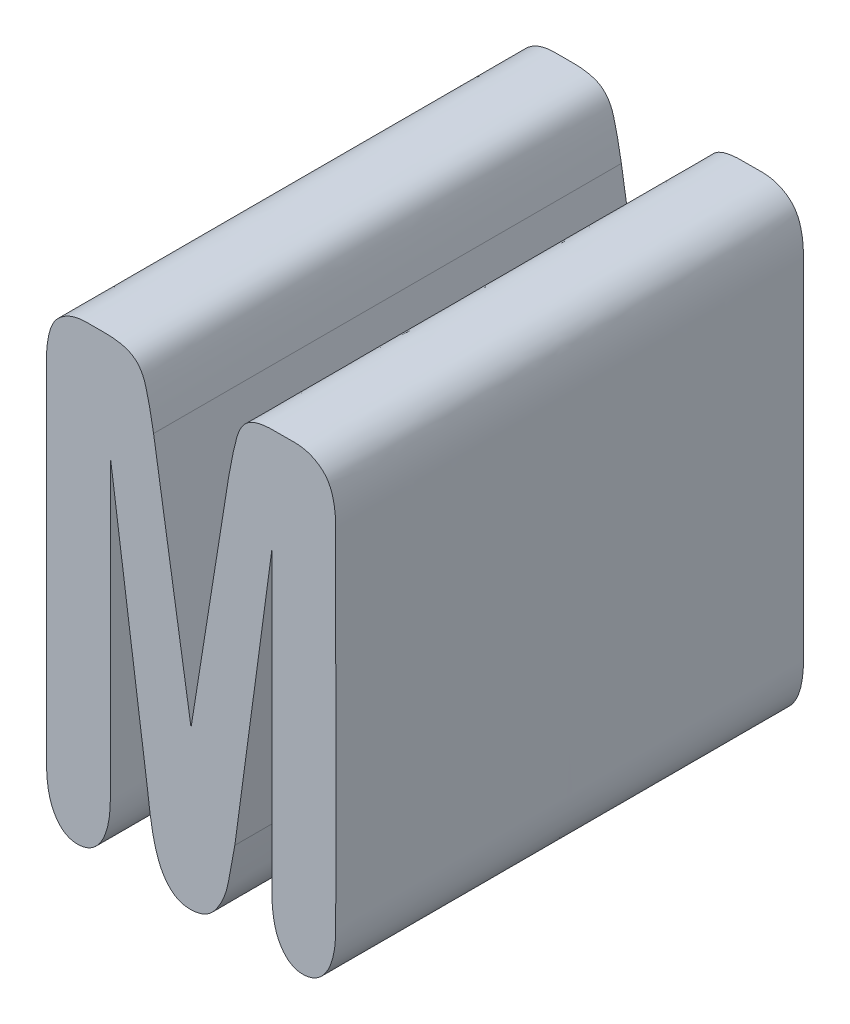
ISO-10303-21;
HEADER;
FILE_DESCRIPTION(('STEP AP214'),'2;1');
FILE_NAME('part.step','',(''),(''),'','','');
FILE_SCHEMA(('AUTOMOTIVE_DESIGN { 1 0 10303 214 1 1 1 1 }'));
ENDSEC;
DATA;
#1=APPLICATION_CONTEXT('core data for automotive mechanical design processes');
#2=APPLICATION_PROTOCOL_DEFINITION('international standard','automotive_design',2000,#1);
#3=PRODUCT_CONTEXT('',#1,'mechanical');
#4=PRODUCT('Part','Part','',(#3));
#5=PRODUCT_RELATED_PRODUCT_CATEGORY('part','',(#4));
#6=PRODUCT_DEFINITION_FORMATION('','',#4);
#7=PRODUCT_DEFINITION_CONTEXT('part definition',#1,'design');
#8=PRODUCT_DEFINITION('design','',#6,#7);
#9=PRODUCT_DEFINITION_SHAPE('','',#8);
#10=(LENGTH_UNIT() NAMED_UNIT(*) SI_UNIT(.MILLI.,.METRE.));
#11=(NAMED_UNIT(*) PLANE_ANGLE_UNIT() SI_UNIT($,.RADIAN.));
#12=(NAMED_UNIT(*) SI_UNIT($,.STERADIAN.) SOLID_ANGLE_UNIT());
#13=UNCERTAINTY_MEASURE_WITH_UNIT(LENGTH_MEASURE(1.E-05),#10,'distance_accuracy_value','');
#14=(GEOMETRIC_REPRESENTATION_CONTEXT(3) GLOBAL_UNCERTAINTY_ASSIGNED_CONTEXT((#13)) GLOBAL_UNIT_ASSIGNED_CONTEXT((#10,
#11,#12)) REPRESENTATION_CONTEXT('',''));
#15=CARTESIAN_POINT('',(0.,0.,0.));
#16=DIRECTION('',(0.,0.,1.));
#17=DIRECTION('',(1.,0.,0.));
#18=AXIS2_PLACEMENT_3D('',#15,#16,#17);
#19=CARTESIAN_POINT('',(-7.60393574297189,-0.00451807228915673,2.79));
#20=DIRECTION('',(0.,0.,1.));
#21=DIRECTION('',(1.,0.,0.));
#22=AXIS2_PLACEMENT_3D('',#19,#20,#21);
#23=PLANE('',#22);
#24=CARTESIAN_POINT('',(-7.50326744070966,0.0369917297939757,2.79));
#25=CARTESIAN_POINT('',(-7.50558921732555,0.0232963210130519,2.79));
#26=CARTESIAN_POINT('',(-7.50723643333539,0.0158603284734269,2.79));
#27=CARTESIAN_POINT('',(-7.50888364934523,0.00842433593380165,2.79));
#28=CARTESIAN_POINT('',(-7.51364488548533,0.00195313182232248,2.79));
#29=CARTESIAN_POINT('',(-7.51840612162544,-0.00451807228915668,2.79));
#30=CARTESIAN_POINT('',(-7.52712850639607,-0.00451807228915668,2.79));
#31=CARTESIAN_POINT('',(-7.53324673072392,-0.00451807228915668,2.79));
#32=CARTESIAN_POINT('',(-7.53745889486074,-0.000517692192436581,2.79));
#33=CARTESIAN_POINT('',(-7.54167105899757,0.00348268790428374,2.79));
#34=CARTESIAN_POINT('',(-7.54396146729284,0.00956561425376479,2.79));
#35=CARTESIAN_POINT('',(-7.54625187558811,0.0156485406032461,2.79));
#36=CARTESIAN_POINT('',(-7.54750689183835,0.0226374369071618,2.79));
#37=CARTESIAN_POINT('',(-7.5487619080886,0.0296263332110773,2.79));
#38=CARTESIAN_POINT('',(-7.55007968396053,0.040756778544712,2.79));
#39=B_SPLINE_CURVE_WITH_KNOTS('',2,(#24,#25,#26,#27,#28,#29,#30,#31,#32,#33,#34,#35,#36,#37,
#38),.UNSPECIFIED.,.F.,.F.,(3,2,2,2,2,2,2,3),(28.,29.,30.,31.,32.,33.,34.,35.),.UNSPECIFIED.);
#40=CARTESIAN_POINT('',(-7.50326744070966,0.0369917297939757,2.79));
#41=VERTEX_POINT('',#40);
#42=CARTESIAN_POINT('',(-7.55007968396053,0.040756778544712,2.79));
#43=VERTEX_POINT('',#42);
#44=EDGE_CURVE('E11',#41,#43,#39,.T.);
#45=ORIENTED_EDGE('',*,*,#44,.F.);
#46=CARTESIAN_POINT('',(-7.48345381526104,0.183734939759036,2.79));
#47=CARTESIAN_POINT('',(-7.49336062798535,0.110363334776506,2.79));
#48=CARTESIAN_POINT('',(-7.50326744070966,0.0369917297939757,2.79));
#49=B_SPLINE_CURVE_WITH_KNOTS('',2,(#46,#47,#48),.UNSPECIFIED.,.F.,.F.,(3,3),(27.,28.),.UNSPECIFIED.);
#50=CARTESIAN_POINT('',(-7.48345381526104,0.183734939759036,2.79));
#51=VERTEX_POINT('',#50);
#52=EDGE_CURVE('E27',#51,#41,#49,.T.);
#53=ORIENTED_EDGE('',*,*,#52,.F.);
#54=CARTESIAN_POINT('',(-7.50654618473896,0.205878216459337,2.79));
#55=CARTESIAN_POINT('',(-7.50403613691816,0.22030309381265,2.79));
#56=CARTESIAN_POINT('',(-7.50195750883292,0.227127266217537,2.79));
#57=CARTESIAN_POINT('',(-7.49987888074768,0.233951438622423,2.79));
#58=CARTESIAN_POINT('',(-7.49532158848256,0.236704634973862,2.79));
#59=CARTESIAN_POINT('',(-7.49076429621745,0.239457831325301,2.79));
#60=CARTESIAN_POINT('',(-7.48163402369683,0.239457831325301,2.79));
#61=CARTESIAN_POINT('',(-7.47677082327938,0.239457831325301,2.79));
#62=CARTESIAN_POINT('',(-7.47190762286194,0.239457831325301,2.79));
#63=CARTESIAN_POINT('',(-7.46177333427706,0.239457831325301,2.79));
#64=CARTESIAN_POINT('',(-7.45554530167668,0.233163128595867,2.79));
#65=CARTESIAN_POINT('',(-7.4493172690763,0.226868425866432,2.79));
#66=CARTESIAN_POINT('',(-7.4493172690763,0.210443352719645,2.79));
#67=CARTESIAN_POINT('',(-7.4493172690763,0.117869934763085,2.79));
#68=CARTESIAN_POINT('',(-7.4493172690763,0.0252965168065258,2.79));
#69=CARTESIAN_POINT('',(-7.4493172690763,0.0112245962563919,2.79));
#70=CARTESIAN_POINT('',(-7.45401574559472,0.00335326198361763,2.79));
#71=CARTESIAN_POINT('',(-7.45871422211314,-0.00451807228915668,2.79));
#72=CARTESIAN_POINT('',(-7.46704442244449,-0.00451807228915668,2.79));
#73=CARTESIAN_POINT('',(-7.47427647876928,-0.00451807228915668,2.79));
#74=CARTESIAN_POINT('',(-7.47886514701516,0.0030591121639223,2.79));
#75=CARTESIAN_POINT('',(-7.48345381526104,0.0106362966170013,2.79));
#76=CARTESIAN_POINT('',(-7.48345381526104,0.0252965168065258,2.79));
#77=CARTESIAN_POINT('',(-7.48345381526104,0.104515728282781,2.79));
#78=CARTESIAN_POINT('',(-7.48345381526104,0.183734939759036,2.79));
#79=B_SPLINE_CURVE_WITH_KNOTS('',2,(#54,#55,#56,#57,#58,#59,#60,#61,#62,#63,#64,#65,#66,#67,#68,
#69,#70,#71,#72,#73,#74,#75,#76,#77,#78),.UNSPECIFIED.,.F.,.F.,(3,2,2,2,2,2,2,2,2,2,2,2,3),(15.,
16.,17.,18.,19.,20.,21.,22.,23.,24.,25.,26.,27.),.UNSPECIFIED.);
#80=CARTESIAN_POINT('',(-7.50654618473896,0.205878216459337,2.79));
#81=VERTEX_POINT('',#80);
#82=EDGE_CURVE('E262',#81,#51,#79,.T.);
#83=ORIENTED_EDGE('',*,*,#82,.F.);
#84=CARTESIAN_POINT('',(-7.52665786668456,0.0798192771084338,2.79));
#85=CARTESIAN_POINT('',(-7.51660202571176,0.142848746783885,2.79));
#86=CARTESIAN_POINT('',(-7.50654618473896,0.205878216459337,2.79));
#87=B_SPLINE_CURVE_WITH_KNOTS('',2,(#84,#85,#86),.UNSPECIFIED.,.F.,.F.,(3,3),(14.,15.),.UNSPECIFIED.);
#88=CARTESIAN_POINT('',(-7.52665786668456,0.0798192771084338,2.79));
#89=VERTEX_POINT('',#88);
#90=EDGE_CURVE('E253',#89,#81,#87,.T.);
#91=ORIENTED_EDGE('',*,*,#90,.F.);
#92=CARTESIAN_POINT('',(-7.54667545132847,0.205878216459337,2.79));
#93=CARTESIAN_POINT('',(-7.53666665900651,0.142848746783885,2.79));
#94=CARTESIAN_POINT('',(-7.52665786668456,0.0798192771084338,2.79));
#95=B_SPLINE_CURVE_WITH_KNOTS('',2,(#92,#93,#94),.UNSPECIFIED.,.F.,.F.,(3,3),(13.,14.),.UNSPECIFIED.);
#96=CARTESIAN_POINT('',(-7.54667545132847,0.205878216459337,2.79));
#97=VERTEX_POINT('',#96);
#98=EDGE_CURVE('E244',#97,#89,#95,.T.);
#99=ORIENTED_EDGE('',*,*,#98,.F.);
#100=CARTESIAN_POINT('',(-7.56979919678715,0.183734939759036,2.79));
#101=CARTESIAN_POINT('',(-7.56979919678715,0.104515728282781,2.79));
#102=CARTESIAN_POINT('',(-7.56979919678715,0.0252965168065258,2.79));
#103=CARTESIAN_POINT('',(-7.56979919678715,0.0112010642708165,2.79));
#104=CARTESIAN_POINT('',(-7.57449767330557,0.00334149599082978,2.79));
#105=CARTESIAN_POINT('',(-7.57919614982399,-0.00451807228915668,2.79));
#106=CARTESIAN_POINT('',(-7.58741653422265,-0.00451807228915668,2.79));
#107=CARTESIAN_POINT('',(-7.59474271848974,-0.00451807228915668,2.79));
#108=CARTESIAN_POINT('',(-7.59933923073081,0.00298852769742286,2.79));
#109=CARTESIAN_POINT('',(-7.60393574297189,0.0104951276840022,2.79));
#110=CARTESIAN_POINT('',(-7.60393574297189,0.0252965168065258,2.79));
#111=CARTESIAN_POINT('',(-7.60393574297189,0.117869934763085,2.79));
#112=CARTESIAN_POINT('',(-7.60393574297189,0.210443352719645,2.79));
#113=CARTESIAN_POINT('',(-7.60393574297189,0.22736259756352,2.79));
#114=CARTESIAN_POINT('',(-7.59793517091177,0.233410214444411,2.79));
#115=CARTESIAN_POINT('',(-7.59193459885165,0.239457831325301,2.79));
#116=CARTESIAN_POINT('',(-7.58231801394944,0.239457831325301,2.79));
#117=CARTESIAN_POINT('',(-7.57743912554161,0.239457831325301,2.79));
#118=CARTESIAN_POINT('',(-7.57256023713378,0.239457831325301,2.79));
#119=CARTESIAN_POINT('',(-7.56306914083434,0.239457831325301,2.79));
#120=CARTESIAN_POINT('',(-7.55818240843131,0.236504613096469,2.79));
#121=CARTESIAN_POINT('',(-7.55329567602829,0.233551394867637,2.79));
#122=CARTESIAN_POINT('',(-7.55120135995267,0.226750754448327,2.79));
#123=CARTESIAN_POINT('',(-7.54910704387704,0.219950114029016,2.79));
#124=CARTESIAN_POINT('',(-7.54667545132847,0.205878216459337,2.79));
#125=B_SPLINE_CURVE_WITH_KNOTS('',2,(#100,#101,#102,#103,#104,#105,#106,#107,#108,#109,#110,
#111,#112,#113,#114,#115,#116,#117,#118,#119,#120,#121,#122,#123,#124),.UNSPECIFIED.,.F.,.F.,(3,
2,2,2,2,2,2,2,2,2,2,2,3),(1.,2.,3.,4.,5.,6.,7.,8.,9.,10.,11.,12.,13.),.UNSPECIFIED.);
#126=CARTESIAN_POINT('',(-7.56979919678715,0.183734939759036,2.79));
#127=VERTEX_POINT('',#126);
#128=EDGE_CURVE('E235',#127,#97,#125,.T.);
#129=ORIENTED_EDGE('',*,*,#128,.F.);
#130=CARTESIAN_POINT('',(-7.55007968396053,0.040756778544712,2.79));
#131=CARTESIAN_POINT('',(-7.55993944037384,0.112245859151874,2.79));
#132=CARTESIAN_POINT('',(-7.56979919678715,0.183734939759036,2.79));
#133=B_SPLINE_CURVE_WITH_KNOTS('',2,(#130,#131,#132),.UNSPECIFIED.,.F.,.F.,(3,3),(0.,1.),.UNSPECIFIED.);
#134=EDGE_CURVE('E226',#43,#127,#133,.T.);
#135=ORIENTED_EDGE('',*,*,#134,.F.);
#136=EDGE_LOOP('',(#45,#53,#83,#91,#99,#129,#135));
#137=FACE_BOUND('',#136,.T.);
#138=ADVANCED_FACE('F17',(#137),#23,.T.);
#139=CARTESIAN_POINT('',(-7.55007968396053,0.0407567785447125,2.54));
#140=CARTESIAN_POINT('',(-7.55993944037384,0.112245859151875,2.54));
#141=CARTESIAN_POINT('',(-7.56979919678715,0.183734939759037,2.54));
#142=CARTESIAN_POINT('',(-7.55007968396053,0.0407567785447125,2.79));
#143=CARTESIAN_POINT('',(-7.55993944037384,0.112245859151875,2.79));
#144=CARTESIAN_POINT('',(-7.56979919678715,0.183734939759037,2.79));
#145=B_SPLINE_SURFACE_WITH_KNOTS('',1,2,((#139,#140,#141),(#142,#143,#144)),.UNSPECIFIED.,.F.,
.F.,.F.,(2,2),(3,3),(0.,0.25),(0.,1.),.UNSPECIFIED.);
#146=CARTESIAN_POINT('',(-7.55007968396053,0.040756778544712,2.79));
#147=CARTESIAN_POINT('',(-7.55007968396053,0.040756778544712,2.54));
#148=B_SPLINE_CURVE_WITH_KNOTS('',1,(#146,#147),.UNSPECIFIED.,.F.,.F.,(2,2),(-0.25,0.),.UNSPECIFIED.);
#149=CARTESIAN_POINT('',(-7.55007968396053,0.040756778544712,2.54));
#150=VERTEX_POINT('',#149);
#151=EDGE_CURVE('E114',#43,#150,#148,.T.);
#152=CARTESIAN_POINT('',(-7.56979919678715,0.183734939759036,2.54));
#153=CARTESIAN_POINT('',(-7.56979919678715,0.183734939759036,2.79));
#154=B_SPLINE_CURVE_WITH_KNOTS('',1,(#152,#153),.UNSPECIFIED.,.F.,.F.,(2,2),(0.,0.25),.UNSPECIFIED.);
#155=CARTESIAN_POINT('',(-7.56979919678715,0.183734939759036,2.54));
#156=VERTEX_POINT('',#155);
#157=EDGE_CURVE('E210',#156,#127,#154,.T.);
#158=CARTESIAN_POINT('',(-7.55007968396053,0.040756778544712,2.54));
#159=CARTESIAN_POINT('',(-7.55993944037384,0.112245859151874,2.54));
#160=CARTESIAN_POINT('',(-7.56979919678715,0.183734939759036,2.54));
#161=B_SPLINE_CURVE_WITH_KNOTS('',2,(#158,#159,#160),.UNSPECIFIED.,.F.,.F.,(3,3),(0.,1.),.UNSPECIFIED.);
#162=EDGE_CURVE('E202',#150,#156,#161,.T.);
#163=ORIENTED_EDGE('',*,*,#151,.F.);
#164=ORIENTED_EDGE('',*,*,#134,.T.);
#165=ORIENTED_EDGE('',*,*,#157,.F.);
#166=ORIENTED_EDGE('',*,*,#162,.F.);
#167=EDGE_LOOP('',(#163,#164,#165,#166));
#168=FACE_BOUND('',#167,.T.);
#169=ADVANCED_FACE('F294',(#168),#145,.T.);
#170=CARTESIAN_POINT('',(-7.56979919678715,0.183734939759036,2.54));
#171=CARTESIAN_POINT('',(-7.56979919678715,0.104515728282781,2.54));
#172=CARTESIAN_POINT('',(-7.56979919678715,0.0252965168065258,2.54));
#173=CARTESIAN_POINT('',(-7.56979919678715,0.0112010642708165,2.54));
#174=CARTESIAN_POINT('',(-7.57449767330557,0.00334149599082978,2.54));
#175=CARTESIAN_POINT('',(-7.57919614982399,-0.00451807228915668,2.54));
#176=CARTESIAN_POINT('',(-7.58741653422265,-0.00451807228915668,2.54));
#177=CARTESIAN_POINT('',(-7.59474271848974,-0.00451807228915668,2.54));
#178=CARTESIAN_POINT('',(-7.59933923073081,0.00298852769742286,2.54));
#179=CARTESIAN_POINT('',(-7.60393574297189,0.0104951276840022,2.54));
#180=CARTESIAN_POINT('',(-7.60393574297189,0.0252965168065258,2.54));
#181=CARTESIAN_POINT('',(-7.60393574297189,0.117869934763085,2.54));
#182=CARTESIAN_POINT('',(-7.60393574297189,0.210443352719645,2.54));
#183=CARTESIAN_POINT('',(-7.60393574297189,0.22736259756352,2.54));
#184=CARTESIAN_POINT('',(-7.59793517091177,0.233410214444411,2.54));
#185=CARTESIAN_POINT('',(-7.59193459885165,0.239457831325301,2.54));
#186=CARTESIAN_POINT('',(-7.58231801394944,0.239457831325301,2.54));
#187=CARTESIAN_POINT('',(-7.57743912554161,0.239457831325301,2.54));
#188=CARTESIAN_POINT('',(-7.57256023713378,0.239457831325301,2.54));
#189=CARTESIAN_POINT('',(-7.56306914083434,0.239457831325301,2.54));
#190=CARTESIAN_POINT('',(-7.55818240843132,0.236504613096469,2.54));
#191=CARTESIAN_POINT('',(-7.55329567602829,0.233551394867637,2.54));
#192=CARTESIAN_POINT('',(-7.55120135995267,0.226750754448327,2.54));
#193=CARTESIAN_POINT('',(-7.54910704387704,0.219950114029016,2.54));
#194=CARTESIAN_POINT('',(-7.54667545132847,0.205878216459337,2.54));
#195=CARTESIAN_POINT('',(-7.56979919678715,0.183734939759036,2.79));
#196=CARTESIAN_POINT('',(-7.56979919678715,0.104515728282781,2.79));
#197=CARTESIAN_POINT('',(-7.56979919678715,0.0252965168065258,2.79));
#198=CARTESIAN_POINT('',(-7.56979919678715,0.0112010642708165,2.79));
#199=CARTESIAN_POINT('',(-7.57449767330557,0.00334149599082978,2.79));
#200=CARTESIAN_POINT('',(-7.57919614982399,-0.00451807228915668,2.79));
#201=CARTESIAN_POINT('',(-7.58741653422265,-0.00451807228915668,2.79));
#202=CARTESIAN_POINT('',(-7.59474271848974,-0.00451807228915668,2.79));
#203=CARTESIAN_POINT('',(-7.59933923073081,0.00298852769742286,2.79));
#204=CARTESIAN_POINT('',(-7.60393574297189,0.0104951276840022,2.79));
#205=CARTESIAN_POINT('',(-7.60393574297189,0.0252965168065258,2.79));
#206=CARTESIAN_POINT('',(-7.60393574297189,0.117869934763085,2.79));
#207=CARTESIAN_POINT('',(-7.60393574297189,0.210443352719645,2.79));
#208=CARTESIAN_POINT('',(-7.60393574297189,0.22736259756352,2.79));
#209=CARTESIAN_POINT('',(-7.59793517091177,0.233410214444411,2.79));
#210=CARTESIAN_POINT('',(-7.59193459885165,0.239457831325301,2.79));
#211=CARTESIAN_POINT('',(-7.58231801394944,0.239457831325301,2.79));
#212=CARTESIAN_POINT('',(-7.57743912554161,0.239457831325301,2.79));
#213=CARTESIAN_POINT('',(-7.57256023713378,0.239457831325301,2.79));
#214=CARTESIAN_POINT('',(-7.56306914083434,0.239457831325301,2.79));
#215=CARTESIAN_POINT('',(-7.55818240843132,0.236504613096469,2.79));
#216=CARTESIAN_POINT('',(-7.55329567602829,0.233551394867637,2.79));
#217=CARTESIAN_POINT('',(-7.55120135995267,0.226750754448327,2.79));
#218=CARTESIAN_POINT('',(-7.54910704387704,0.219950114029016,2.79));
#219=CARTESIAN_POINT('',(-7.54667545132847,0.205878216459337,2.79));
#220=B_SPLINE_SURFACE_WITH_KNOTS('',1,2,((#170,#171,#172,#173,#174,#175,#176,#177,#178,#179,
#180,#181,#182,#183,#184,#185,#186,#187,#188,#189,#190,#191,#192,#193,#194),(#195,#196,#197,
#198,#199,#200,#201,#202,#203,#204,#205,#206,#207,#208,#209,#210,#211,#212,#213,#214,#215,#216,
#217,#218,#219)),.UNSPECIFIED.,.F.,.F.,.F.,(2,2),(3,2,2,2,2,2,2,2,2,2,2,2,3),(0.,0.25),(1.,2.,
3.,4.,5.,6.,7.,8.,9.,10.,11.,12.,13.),.UNSPECIFIED.);
#221=CARTESIAN_POINT('',(-7.54667545132847,0.205878216459337,2.54));
#222=CARTESIAN_POINT('',(-7.54667545132847,0.205878216459337,2.79));
#223=B_SPLINE_CURVE_WITH_KNOTS('',1,(#221,#222),.UNSPECIFIED.,.F.,.F.,(2,2),(0.,0.25),.UNSPECIFIED.);
#224=CARTESIAN_POINT('',(-7.54667545132847,0.205878216459337,2.54));
#225=VERTEX_POINT('',#224);
#226=EDGE_CURVE('E193',#225,#97,#223,.T.);
#227=CARTESIAN_POINT('',(-7.56979919678715,0.183734939759036,2.54));
#228=CARTESIAN_POINT('',(-7.56979919678715,0.104515728282781,2.54));
#229=CARTESIAN_POINT('',(-7.56979919678715,0.0252965168065258,2.54));
#230=CARTESIAN_POINT('',(-7.56979919678715,0.0112010642708165,2.54));
#231=CARTESIAN_POINT('',(-7.57449767330557,0.00334149599082978,2.54));
#232=CARTESIAN_POINT('',(-7.57919614982399,-0.00451807228915668,2.54));
#233=CARTESIAN_POINT('',(-7.58741653422265,-0.00451807228915668,2.54));
#234=CARTESIAN_POINT('',(-7.59474271848974,-0.00451807228915668,2.54));
#235=CARTESIAN_POINT('',(-7.59933923073081,0.00298852769742286,2.54));
#236=CARTESIAN_POINT('',(-7.60393574297189,0.0104951276840022,2.54));
#237=CARTESIAN_POINT('',(-7.60393574297189,0.0252965168065258,2.54));
#238=CARTESIAN_POINT('',(-7.60393574297189,0.117869934763085,2.54));
#239=CARTESIAN_POINT('',(-7.60393574297189,0.210443352719645,2.54));
#240=CARTESIAN_POINT('',(-7.60393574297189,0.22736259756352,2.54));
#241=CARTESIAN_POINT('',(-7.59793517091177,0.233410214444411,2.54));
#242=CARTESIAN_POINT('',(-7.59193459885165,0.239457831325301,2.54));
#243=CARTESIAN_POINT('',(-7.58231801394944,0.239457831325301,2.54));
#244=CARTESIAN_POINT('',(-7.57743912554161,0.239457831325301,2.54));
#245=CARTESIAN_POINT('',(-7.57256023713378,0.239457831325301,2.54));
#246=CARTESIAN_POINT('',(-7.56306914083434,0.239457831325301,2.54));
#247=CARTESIAN_POINT('',(-7.55818240843131,0.236504613096469,2.54));
#248=CARTESIAN_POINT('',(-7.55329567602829,0.233551394867637,2.54));
#249=CARTESIAN_POINT('',(-7.55120135995267,0.226750754448327,2.54));
#250=CARTESIAN_POINT('',(-7.54910704387704,0.219950114029016,2.54));
#251=CARTESIAN_POINT('',(-7.54667545132847,0.205878216459337,2.54));
#252=B_SPLINE_CURVE_WITH_KNOTS('',2,(#227,#228,#229,#230,#231,#232,#233,#234,#235,#236,#237,
#238,#239,#240,#241,#242,#243,#244,#245,#246,#247,#248,#249,#250,#251),.UNSPECIFIED.,.F.,.F.,(3,
2,2,2,2,2,2,2,2,2,2,2,3),(1.,2.,3.,4.,5.,6.,7.,8.,9.,10.,11.,12.,13.),.UNSPECIFIED.);
#253=EDGE_CURVE('E184',#156,#225,#252,.T.);
#254=ORIENTED_EDGE('',*,*,#157,.T.);
#255=ORIENTED_EDGE('',*,*,#128,.T.);
#256=ORIENTED_EDGE('',*,*,#226,.F.);
#257=ORIENTED_EDGE('',*,*,#253,.F.);
#258=EDGE_LOOP('',(#254,#255,#256,#257));
#259=FACE_BOUND('',#258,.T.);
#260=ADVANCED_FACE('F298',(#259),#220,.T.);
#261=CARTESIAN_POINT('',(-7.54667545132847,0.205878216459337,2.54));
#262=CARTESIAN_POINT('',(-7.53666665900651,0.142848746783885,2.54));
#263=CARTESIAN_POINT('',(-7.52665786668456,0.0798192771084338,2.54));
#264=CARTESIAN_POINT('',(-7.54667545132847,0.205878216459337,2.79));
#265=CARTESIAN_POINT('',(-7.53666665900651,0.142848746783885,2.79));
#266=CARTESIAN_POINT('',(-7.52665786668456,0.0798192771084338,2.79));
#267=B_SPLINE_SURFACE_WITH_KNOTS('',1,2,((#261,#262,#263),(#264,#265,#266)),.UNSPECIFIED.,.F.,
.F.,.F.,(2,2),(3,3),(0.,0.25),(13.,14.),.UNSPECIFIED.);
#268=CARTESIAN_POINT('',(-7.52665786668456,0.0798192771084338,2.54));
#269=CARTESIAN_POINT('',(-7.52665786668456,0.0798192771084338,2.79));
#270=B_SPLINE_CURVE_WITH_KNOTS('',1,(#268,#269),.UNSPECIFIED.,.F.,.F.,(2,2),(0.,0.25),.UNSPECIFIED.);
#271=CARTESIAN_POINT('',(-7.52665786668456,0.0798192771084338,2.54));
#272=VERTEX_POINT('',#271);
#273=EDGE_CURVE('E175',#272,#89,#270,.T.);
#274=CARTESIAN_POINT('',(-7.54667545132847,0.205878216459337,2.54));
#275=CARTESIAN_POINT('',(-7.53666665900651,0.142848746783885,2.54));
#276=CARTESIAN_POINT('',(-7.52665786668456,0.0798192771084338,2.54));
#277=B_SPLINE_CURVE_WITH_KNOTS('',2,(#274,#275,#276),.UNSPECIFIED.,.F.,.F.,(3,3),(13.,14.),.UNSPECIFIED.);
#278=EDGE_CURVE('E166',#225,#272,#277,.T.);
#279=ORIENTED_EDGE('',*,*,#226,.T.);
#280=ORIENTED_EDGE('',*,*,#98,.T.);
#281=ORIENTED_EDGE('',*,*,#273,.F.);
#282=ORIENTED_EDGE('',*,*,#278,.F.);
#283=EDGE_LOOP('',(#279,#280,#281,#282));
#284=FACE_BOUND('',#283,.T.);
#285=ADVANCED_FACE('F313',(#284),#267,.T.);
#286=CARTESIAN_POINT('',(-7.52665786668456,0.0798192771084334,2.54));
#287=CARTESIAN_POINT('',(-7.51660202571176,0.142848746783885,2.54));
#288=CARTESIAN_POINT('',(-7.50654618473896,0.205878216459336,2.54));
#289=CARTESIAN_POINT('',(-7.52665786668456,0.0798192771084334,2.79));
#290=CARTESIAN_POINT('',(-7.51660202571176,0.142848746783885,2.79));
#291=CARTESIAN_POINT('',(-7.50654618473896,0.205878216459336,2.79));
#292=B_SPLINE_SURFACE_WITH_KNOTS('',1,2,((#286,#287,#288),(#289,#290,#291)),.UNSPECIFIED.,.F.,
.F.,.F.,(2,2),(3,3),(0.,0.25),(14.,15.),.UNSPECIFIED.);
#293=CARTESIAN_POINT('',(-7.50654618473896,0.205878216459337,2.54));
#294=CARTESIAN_POINT('',(-7.50654618473896,0.205878216459337,2.79));
#295=B_SPLINE_CURVE_WITH_KNOTS('',1,(#293,#294),.UNSPECIFIED.,.F.,.F.,(2,2),(0.,0.25),.UNSPECIFIED.);
#296=CARTESIAN_POINT('',(-7.50654618473896,0.205878216459337,2.54));
#297=VERTEX_POINT('',#296);
#298=EDGE_CURVE('E157',#297,#81,#295,.T.);
#299=CARTESIAN_POINT('',(-7.52665786668456,0.0798192771084338,2.54));
#300=CARTESIAN_POINT('',(-7.51660202571176,0.142848746783885,2.54));
#301=CARTESIAN_POINT('',(-7.50654618473896,0.205878216459337,2.54));
#302=B_SPLINE_CURVE_WITH_KNOTS('',2,(#299,#300,#301),.UNSPECIFIED.,.F.,.F.,(3,3),(14.,15.),.UNSPECIFIED.);
#303=EDGE_CURVE('E149',#272,#297,#302,.T.);
#304=ORIENTED_EDGE('',*,*,#273,.T.);
#305=ORIENTED_EDGE('',*,*,#90,.T.);
#306=ORIENTED_EDGE('',*,*,#298,.F.);
#307=ORIENTED_EDGE('',*,*,#303,.F.);
#308=EDGE_LOOP('',(#304,#305,#306,#307));
#309=FACE_BOUND('',#308,.T.);
#310=ADVANCED_FACE('F325',(#309),#292,.T.);
#311=CARTESIAN_POINT('',(-7.50654618473896,0.205878216459337,2.54));
#312=CARTESIAN_POINT('',(-7.50403613691816,0.22030309381265,2.54));
#313=CARTESIAN_POINT('',(-7.50195750883292,0.227127266217537,2.54));
#314=CARTESIAN_POINT('',(-7.49987888074768,0.233951438622423,2.54));
#315=CARTESIAN_POINT('',(-7.49532158848257,0.236704634973862,2.54));
#316=CARTESIAN_POINT('',(-7.49076429621745,0.239457831325301,2.54));
#317=CARTESIAN_POINT('',(-7.48163402369683,0.239457831325301,2.54));
#318=CARTESIAN_POINT('',(-7.47677082327939,0.239457831325301,2.54));
#319=CARTESIAN_POINT('',(-7.47190762286194,0.239457831325301,2.54));
#320=CARTESIAN_POINT('',(-7.46177333427707,0.239457831325301,2.54));
#321=CARTESIAN_POINT('',(-7.45554530167669,0.233163128595867,2.54));
#322=CARTESIAN_POINT('',(-7.44931726907631,0.226868425866432,2.54));
#323=CARTESIAN_POINT('',(-7.44931726907631,0.210443352719645,2.54));
#324=CARTESIAN_POINT('',(-7.44931726907631,0.117869934763085,2.54));
#325=CARTESIAN_POINT('',(-7.44931726907631,0.0252965168065258,2.54));
#326=CARTESIAN_POINT('',(-7.44931726907631,0.0112245962563919,2.54));
#327=CARTESIAN_POINT('',(-7.45401574559472,0.00335326198361763,2.54));
#328=CARTESIAN_POINT('',(-7.45871422211314,-0.00451807228915668,2.54));
#329=CARTESIAN_POINT('',(-7.46704442244449,-0.00451807228915668,2.54));
#330=CARTESIAN_POINT('',(-7.47427647876928,-0.00451807228915668,2.54));
#331=CARTESIAN_POINT('',(-7.47886514701516,0.0030591121639223,2.54));
#332=CARTESIAN_POINT('',(-7.48345381526105,0.0106362966170013,2.54));
#333=CARTESIAN_POINT('',(-7.48345381526105,0.0252965168065258,2.54));
#334=CARTESIAN_POINT('',(-7.48345381526105,0.104515728282781,2.54));
#335=CARTESIAN_POINT('',(-7.48345381526105,0.183734939759036,2.54));
#336=CARTESIAN_POINT('',(-7.50654618473896,0.205878216459337,2.79));
#337=CARTESIAN_POINT('',(-7.50403613691816,0.22030309381265,2.79));
#338=CARTESIAN_POINT('',(-7.50195750883292,0.227127266217537,2.79));
#339=CARTESIAN_POINT('',(-7.49987888074768,0.233951438622423,2.79));
#340=CARTESIAN_POINT('',(-7.49532158848257,0.236704634973862,2.79));
#341=CARTESIAN_POINT('',(-7.49076429621745,0.239457831325301,2.79));
#342=CARTESIAN_POINT('',(-7.48163402369683,0.239457831325301,2.79));
#343=CARTESIAN_POINT('',(-7.47677082327939,0.239457831325301,2.79));
#344=CARTESIAN_POINT('',(-7.47190762286194,0.239457831325301,2.79));
#345=CARTESIAN_POINT('',(-7.46177333427707,0.239457831325301,2.79));
#346=CARTESIAN_POINT('',(-7.45554530167669,0.233163128595867,2.79));
#347=CARTESIAN_POINT('',(-7.44931726907631,0.226868425866432,2.79));
#348=CARTESIAN_POINT('',(-7.44931726907631,0.210443352719645,2.79));
#349=CARTESIAN_POINT('',(-7.44931726907631,0.117869934763085,2.79));
#350=CARTESIAN_POINT('',(-7.44931726907631,0.0252965168065258,2.79));
#351=CARTESIAN_POINT('',(-7.44931726907631,0.0112245962563919,2.79));
#352=CARTESIAN_POINT('',(-7.45401574559472,0.00335326198361763,2.79));
#353=CARTESIAN_POINT('',(-7.45871422211314,-0.00451807228915668,2.79));
#354=CARTESIAN_POINT('',(-7.46704442244449,-0.00451807228915668,2.79));
#355=CARTESIAN_POINT('',(-7.47427647876928,-0.00451807228915668,2.79));
#356=CARTESIAN_POINT('',(-7.47886514701516,0.0030591121639223,2.79));
#357=CARTESIAN_POINT('',(-7.48345381526105,0.0106362966170013,2.79));
#358=CARTESIAN_POINT('',(-7.48345381526105,0.0252965168065258,2.79));
#359=CARTESIAN_POINT('',(-7.48345381526105,0.104515728282781,2.79));
#360=CARTESIAN_POINT('',(-7.48345381526105,0.183734939759036,2.79));
#361=B_SPLINE_SURFACE_WITH_KNOTS('',1,2,((#311,#312,#313,#314,#315,#316,#317,#318,#319,#320,
#321,#322,#323,#324,#325,#326,#327,#328,#329,#330,#331,#332,#333,#334,#335),(#336,#337,#338,
#339,#340,#341,#342,#343,#344,#345,#346,#347,#348,#349,#350,#351,#352,#353,#354,#355,#356,#357,
#358,#359,#360)),.UNSPECIFIED.,.F.,.F.,.F.,(2,2),(3,2,2,2,2,2,2,2,2,2,2,2,3),(0.,0.25),(15.,16.,
17.,18.,19.,20.,21.,22.,23.,24.,25.,26.,27.),.UNSPECIFIED.);
#362=CARTESIAN_POINT('',(-7.48345381526104,0.183734939759036,2.54));
#363=CARTESIAN_POINT('',(-7.48345381526104,0.183734939759036,2.79));
#364=B_SPLINE_CURVE_WITH_KNOTS('',1,(#362,#363),.UNSPECIFIED.,.F.,.F.,(2,2),(0.,0.25),.UNSPECIFIED.);
#365=CARTESIAN_POINT('',(-7.48345381526104,0.183734939759036,2.54));
#366=VERTEX_POINT('',#365);
#367=EDGE_CURVE('E141',#366,#51,#364,.T.);
#368=CARTESIAN_POINT('',(-7.50654618473896,0.205878216459337,2.54));
#369=CARTESIAN_POINT('',(-7.50403613691816,0.22030309381265,2.54));
#370=CARTESIAN_POINT('',(-7.50195750883292,0.227127266217537,2.54));
#371=CARTESIAN_POINT('',(-7.49987888074768,0.233951438622423,2.54));
#372=CARTESIAN_POINT('',(-7.49532158848256,0.236704634973862,2.54));
#373=CARTESIAN_POINT('',(-7.49076429621745,0.239457831325301,2.54));
#374=CARTESIAN_POINT('',(-7.48163402369683,0.239457831325301,2.54));
#375=CARTESIAN_POINT('',(-7.47677082327938,0.239457831325301,2.54));
#376=CARTESIAN_POINT('',(-7.47190762286194,0.239457831325301,2.54));
#377=CARTESIAN_POINT('',(-7.46177333427706,0.239457831325301,2.54));
#378=CARTESIAN_POINT('',(-7.45554530167668,0.233163128595867,2.54));
#379=CARTESIAN_POINT('',(-7.4493172690763,0.226868425866432,2.54));
#380=CARTESIAN_POINT('',(-7.4493172690763,0.210443352719645,2.54));
#381=CARTESIAN_POINT('',(-7.4493172690763,0.117869934763085,2.54));
#382=CARTESIAN_POINT('',(-7.4493172690763,0.0252965168065258,2.54));
#383=CARTESIAN_POINT('',(-7.4493172690763,0.0112245962563919,2.54));
#384=CARTESIAN_POINT('',(-7.45401574559472,0.00335326198361763,2.54));
#385=CARTESIAN_POINT('',(-7.45871422211314,-0.00451807228915668,2.54));
#386=CARTESIAN_POINT('',(-7.46704442244449,-0.00451807228915668,2.54));
#387=CARTESIAN_POINT('',(-7.47427647876928,-0.00451807228915668,2.54));
#388=CARTESIAN_POINT('',(-7.47886514701516,0.0030591121639223,2.54));
#389=CARTESIAN_POINT('',(-7.48345381526104,0.0106362966170013,2.54));
#390=CARTESIAN_POINT('',(-7.48345381526104,0.0252965168065258,2.54));
#391=CARTESIAN_POINT('',(-7.48345381526104,0.104515728282781,2.54));
#392=CARTESIAN_POINT('',(-7.48345381526104,0.183734939759036,2.54));
#393=B_SPLINE_CURVE_WITH_KNOTS('',2,(#368,#369,#370,#371,#372,#373,#374,#375,#376,#377,#378,
#379,#380,#381,#382,#383,#384,#385,#386,#387,#388,#389,#390,#391,#392),.UNSPECIFIED.,.F.,.F.,(3,
2,2,2,2,2,2,2,2,2,2,2,3),(15.,16.,17.,18.,19.,20.,21.,22.,23.,24.,25.,26.,27.),.UNSPECIFIED.);
#394=EDGE_CURVE('E100',#297,#366,#393,.T.);
#395=ORIENTED_EDGE('',*,*,#298,.T.);
#396=ORIENTED_EDGE('',*,*,#82,.T.);
#397=ORIENTED_EDGE('',*,*,#367,.F.);
#398=ORIENTED_EDGE('',*,*,#394,.F.);
#399=EDGE_LOOP('',(#395,#396,#397,#398));
#400=FACE_BOUND('',#399,.T.);
#401=ADVANCED_FACE('F337',(#400),#361,.T.);
#402=CARTESIAN_POINT('',(-7.48345381526104,0.183734939759036,2.54));
#403=CARTESIAN_POINT('',(-7.49336062798535,0.110363334776506,2.54));
#404=CARTESIAN_POINT('',(-7.50326744070966,0.0369917297939757,2.54));
#405=CARTESIAN_POINT('',(-7.48345381526104,0.183734939759036,2.79));
#406=CARTESIAN_POINT('',(-7.49336062798535,0.110363334776506,2.79));
#407=CARTESIAN_POINT('',(-7.50326744070966,0.0369917297939757,2.79));
#408=B_SPLINE_SURFACE_WITH_KNOTS('',1,2,((#402,#403,#404),(#405,#406,#407)),.UNSPECIFIED.,.F.,
.F.,.F.,(2,2),(3,3),(0.,0.25),(27.,28.),.UNSPECIFIED.);
#409=CARTESIAN_POINT('',(-7.50326744070966,0.0369917297939757,2.54));
#410=CARTESIAN_POINT('',(-7.50326744070966,0.0369917297939757,2.79));
#411=B_SPLINE_CURVE_WITH_KNOTS('',1,(#409,#410),.UNSPECIFIED.,.F.,.F.,(2,2),(0.,0.25),.UNSPECIFIED.);
#412=CARTESIAN_POINT('',(-7.50326744070966,0.0369917297939757,2.54));
#413=VERTEX_POINT('',#412);
#414=EDGE_CURVE('E94',#413,#41,#411,.T.);
#415=CARTESIAN_POINT('',(-7.48345381526104,0.183734939759036,2.54));
#416=CARTESIAN_POINT('',(-7.49336062798535,0.110363334776506,2.54));
#417=CARTESIAN_POINT('',(-7.50326744070966,0.0369917297939757,2.54));
#418=B_SPLINE_CURVE_WITH_KNOTS('',2,(#415,#416,#417),.UNSPECIFIED.,.F.,.F.,(3,3),(27.,28.),.UNSPECIFIED.);
#419=EDGE_CURVE('E98',#366,#413,#418,.T.);
#420=ORIENTED_EDGE('',*,*,#367,.T.);
#421=ORIENTED_EDGE('',*,*,#52,.T.);
#422=ORIENTED_EDGE('',*,*,#414,.F.);
#423=ORIENTED_EDGE('',*,*,#419,.F.);
#424=EDGE_LOOP('',(#420,#421,#422,#423));
#425=FACE_BOUND('',#424,.T.);
#426=ADVANCED_FACE('F97',(#425),#408,.T.);
#427=CARTESIAN_POINT('',(-7.50326744070966,0.0369917297939761,2.54));
#428=CARTESIAN_POINT('',(-7.50558921732555,0.0232963210130523,2.54));
#429=CARTESIAN_POINT('',(-7.50723643333539,0.0158603284734273,2.54));
#430=CARTESIAN_POINT('',(-7.50888364934523,0.0084243359338021,2.54));
#431=CARTESIAN_POINT('',(-7.51364488548533,0.00195313182232293,2.54));
#432=CARTESIAN_POINT('',(-7.51840612162544,-0.00451807228915624,2.54));
#433=CARTESIAN_POINT('',(-7.52712850639607,-0.00451807228915624,2.54));
#434=CARTESIAN_POINT('',(-7.53324673072392,-0.00451807228915624,2.54));
#435=CARTESIAN_POINT('',(-7.53745889486074,-0.000517692192436137,2.54));
#436=CARTESIAN_POINT('',(-7.54167105899757,0.00348268790428419,2.54));
#437=CARTESIAN_POINT('',(-7.54396146729284,0.00956561425376523,2.54));
#438=CARTESIAN_POINT('',(-7.54625187558811,0.0156485406032465,2.54));
#439=CARTESIAN_POINT('',(-7.54750689183836,0.0226374369071622,2.54));
#440=CARTESIAN_POINT('',(-7.5487619080886,0.0296263332110778,2.54));
#441=CARTESIAN_POINT('',(-7.55007968396053,0.0407567785447125,2.54));
#442=CARTESIAN_POINT('',(-7.50326744070966,0.0369917297939761,2.79));
#443=CARTESIAN_POINT('',(-7.50558921732555,0.0232963210130523,2.79));
#444=CARTESIAN_POINT('',(-7.50723643333539,0.0158603284734273,2.79));
#445=CARTESIAN_POINT('',(-7.50888364934523,0.0084243359338021,2.79));
#446=CARTESIAN_POINT('',(-7.51364488548533,0.00195313182232293,2.79));
#447=CARTESIAN_POINT('',(-7.51840612162544,-0.00451807228915624,2.79));
#448=CARTESIAN_POINT('',(-7.52712850639607,-0.00451807228915624,2.79));
#449=CARTESIAN_POINT('',(-7.53324673072392,-0.00451807228915624,2.79));
#450=CARTESIAN_POINT('',(-7.53745889486074,-0.000517692192436137,2.79));
#451=CARTESIAN_POINT('',(-7.54167105899757,0.00348268790428419,2.79));
#452=CARTESIAN_POINT('',(-7.54396146729284,0.00956561425376523,2.79));
#453=CARTESIAN_POINT('',(-7.54625187558811,0.0156485406032465,2.79));
#454=CARTESIAN_POINT('',(-7.54750689183836,0.0226374369071622,2.79));
#455=CARTESIAN_POINT('',(-7.5487619080886,0.0296263332110778,2.79));
#456=CARTESIAN_POINT('',(-7.55007968396053,0.0407567785447125,2.79));
#457=B_SPLINE_SURFACE_WITH_KNOTS('',1,2,((#427,#428,#429,#430,#431,#432,#433,#434,#435,#436,
#437,#438,#439,#440,#441),(#442,#443,#444,#445,#446,#447,#448,#449,#450,#451,#452,#453,#454,
#455,#456)),.UNSPECIFIED.,.F.,.F.,.F.,(2,2),(3,2,2,2,2,2,2,3),(0.,0.25),(28.,29.,30.,31.,32.,
33.,34.,35.),.UNSPECIFIED.);
#458=CARTESIAN_POINT('',(-7.50326744070966,0.0369917297939757,2.54));
#459=CARTESIAN_POINT('',(-7.50558921732555,0.0232963210130519,2.54));
#460=CARTESIAN_POINT('',(-7.50723643333539,0.0158603284734269,2.54));
#461=CARTESIAN_POINT('',(-7.50888364934523,0.00842433593380165,2.54));
#462=CARTESIAN_POINT('',(-7.51364488548533,0.00195313182232248,2.54));
#463=CARTESIAN_POINT('',(-7.51840612162544,-0.00451807228915668,2.54));
#464=CARTESIAN_POINT('',(-7.52712850639607,-0.00451807228915668,2.54));
#465=CARTESIAN_POINT('',(-7.53324673072392,-0.00451807228915668,2.54));
#466=CARTESIAN_POINT('',(-7.53745889486074,-0.000517692192436581,2.54));
#467=CARTESIAN_POINT('',(-7.54167105899757,0.00348268790428374,2.54));
#468=CARTESIAN_POINT('',(-7.54396146729284,0.00956561425376479,2.54));
#469=CARTESIAN_POINT('',(-7.54625187558811,0.0156485406032461,2.54));
#470=CARTESIAN_POINT('',(-7.54750689183835,0.0226374369071618,2.54));
#471=CARTESIAN_POINT('',(-7.5487619080886,0.0296263332110773,2.54));
#472=CARTESIAN_POINT('',(-7.55007968396053,0.040756778544712,2.54));
#473=B_SPLINE_CURVE_WITH_KNOTS('',2,(#458,#459,#460,#461,#462,#463,#464,#465,#466,#467,#468,
#469,#470,#471,#472),.UNSPECIFIED.,.F.,.F.,(3,2,2,2,2,2,2,3),(28.,29.,30.,31.,32.,33.,34.,35.),.UNSPECIFIED.);
#474=EDGE_CURVE('E107',#413,#150,#473,.T.);
#475=ORIENTED_EDGE('',*,*,#414,.T.);
#476=ORIENTED_EDGE('',*,*,#44,.T.);
#477=ORIENTED_EDGE('',*,*,#151,.T.);
#478=ORIENTED_EDGE('',*,*,#474,.F.);
#479=EDGE_LOOP('',(#475,#476,#477,#478));
#480=FACE_BOUND('',#479,.T.);
#481=ADVANCED_FACE('F112',(#480),#457,.T.);
#482=CARTESIAN_POINT('',(-7.60393574297189,-0.00451807228915673,2.54));
#483=DIRECTION('',(0.,0.,-1.));
#484=DIRECTION('',(0.,-1.,0.));
#485=AXIS2_PLACEMENT_3D('',#482,#483,#484);
#486=PLANE('',#485);
#487=ORIENTED_EDGE('',*,*,#162,.T.);
#488=ORIENTED_EDGE('',*,*,#253,.T.);
#489=ORIENTED_EDGE('',*,*,#278,.T.);
#490=ORIENTED_EDGE('',*,*,#303,.T.);
#491=ORIENTED_EDGE('',*,*,#394,.T.);
#492=ORIENTED_EDGE('',*,*,#419,.T.);
#493=ORIENTED_EDGE('',*,*,#474,.T.);
#494=EDGE_LOOP('',(#487,#488,#489,#490,#491,#492,#493));
#495=FACE_BOUND('',#494,.T.);
#496=ADVANCED_FACE('F106',(#495),#486,.T.);
#497=CLOSED_SHELL('',(#138,#169,#260,#285,#310,#401,#426,#481,#496));
#498=MANIFOLD_SOLID_BREP('B1',#497);
#499=ADVANCED_BREP_SHAPE_REPRESENTATION('',(#18,#498),#14);
#500=SHAPE_DEFINITION_REPRESENTATION(#9,#499);
ENDSEC;
END-ISO-10303-21;
